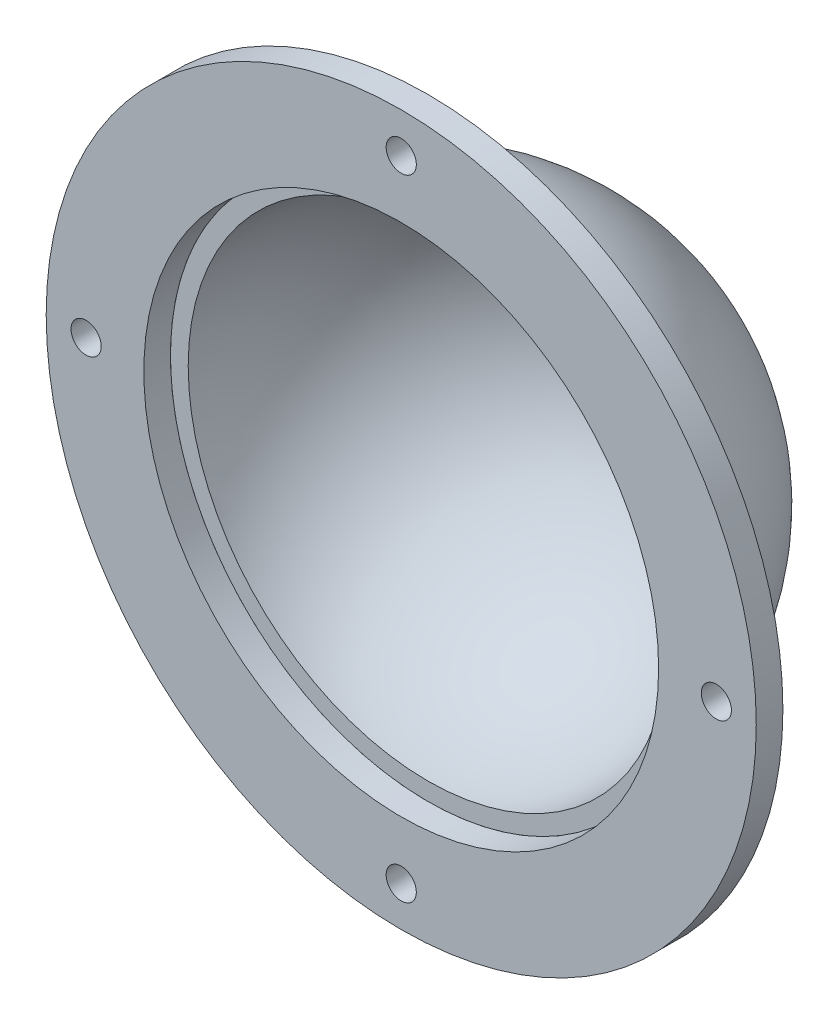
ISO-10303-21;
HEADER;
FILE_DESCRIPTION(('STEP AP214'),'2;1');
FILE_NAME('part.step','',(''),(''),'','','');
FILE_SCHEMA(('AUTOMOTIVE_DESIGN { 1 0 10303 214 1 1 1 1 }'));
ENDSEC;
DATA;
#1=APPLICATION_CONTEXT('core data for automotive mechanical design processes');
#2=APPLICATION_PROTOCOL_DEFINITION('international standard','automotive_design',2000,#1);
#3=PRODUCT_CONTEXT('',#1,'mechanical');
#4=PRODUCT('Part','Part','',(#3));
#5=PRODUCT_RELATED_PRODUCT_CATEGORY('part','',(#4));
#6=PRODUCT_DEFINITION_FORMATION('','',#4);
#7=PRODUCT_DEFINITION_CONTEXT('part definition',#1,'design');
#8=PRODUCT_DEFINITION('design','',#6,#7);
#9=PRODUCT_DEFINITION_SHAPE('','',#8);
#10=(LENGTH_UNIT() NAMED_UNIT(*) SI_UNIT(.MILLI.,.METRE.));
#11=(NAMED_UNIT(*) PLANE_ANGLE_UNIT() SI_UNIT($,.RADIAN.));
#12=(NAMED_UNIT(*) SI_UNIT($,.STERADIAN.) SOLID_ANGLE_UNIT());
#13=UNCERTAINTY_MEASURE_WITH_UNIT(LENGTH_MEASURE(1.E-05),#10,'distance_accuracy_value','');
#14=(GEOMETRIC_REPRESENTATION_CONTEXT(3) GLOBAL_UNCERTAINTY_ASSIGNED_CONTEXT((#13)) GLOBAL_UNIT_ASSIGNED_CONTEXT((#10,
#11,#12)) REPRESENTATION_CONTEXT('',''));
#15=CARTESIAN_POINT('',(0.,0.,0.));
#16=DIRECTION('',(0.,0.,1.));
#17=DIRECTION('',(1.,0.,0.));
#18=AXIS2_PLACEMENT_3D('',#15,#16,#17);
#19=CARTESIAN_POINT('',(0.,0.,0.));
#20=DIRECTION('',(0.,0.,-1.));
#21=DIRECTION('',(1.,0.,0.));
#22=AXIS2_PLACEMENT_3D('',#19,#20,#21);
#23=SPHERICAL_SURFACE('',#22,27.);
#24=CARTESIAN_POINT('',(0.,0.,0.));
#25=DIRECTION('',(0.,0.,-1.));
#26=DIRECTION('',(-1.,0.,0.));
#27=AXIS2_PLACEMENT_3D('',#24,#25,#26);
#28=CIRCLE('',#27,27.);
#29=CARTESIAN_POINT('',(-27.,0.,0.));
#30=VERTEX_POINT('',#29);
#31=EDGE_CURVE('E11',#30,#30,#28,.T.);
#32=ORIENTED_EDGE('',*,*,#31,.F.);
#33=EDGE_LOOP('',(#32));
#34=FACE_BOUND('',#33,.T.);
#35=ADVANCED_FACE('F47',(#34),#23,.F.);
#36=CARTESIAN_POINT('',(0.,0.,0.));
#37=DIRECTION('',(0.,0.,1.));
#38=DIRECTION('',(1.,0.,0.));
#39=AXIS2_PLACEMENT_3D('',#36,#37,#38);
#40=PLANE('',#39);
#41=ORIENTED_EDGE('',*,*,#31,.T.);
#42=EDGE_LOOP('',(#41));
#43=FACE_BOUND('',#42,.T.);
#44=CARTESIAN_POINT('',(0.,0.,0.));
#45=DIRECTION('',(0.,0.,-1.));
#46=DIRECTION('',(-1.,0.,0.));
#47=AXIS2_PLACEMENT_3D('',#44,#45,#46);
#48=CIRCLE('',#47,29.);
#49=CARTESIAN_POINT('',(-29.,0.,0.));
#50=VERTEX_POINT('',#49);
#51=EDGE_CURVE('E54',#50,#50,#48,.T.);
#52=ORIENTED_EDGE('',*,*,#51,.F.);
#53=EDGE_LOOP('',(#52));
#54=FACE_BOUND('',#53,.T.);
#55=ADVANCED_FACE('F64',(#43,#54),#40,.T.);
#56=CARTESIAN_POINT('',(0.,0.,0.));
#57=DIRECTION('',(0.,0.,-1.));
#58=DIRECTION('',(1.,0.,0.));
#59=AXIS2_PLACEMENT_3D('',#56,#57,#58);
#60=SPHERICAL_SURFACE('',#59,29.);
#61=ORIENTED_EDGE('',*,*,#51,.T.);
#62=EDGE_LOOP('',(#61));
#63=FACE_BOUND('',#62,.T.);
#64=ADVANCED_FACE('F62',(#63),#60,.T.);
#65=CLOSED_SHELL('',(#35,#55,#64));
#66=MANIFOLD_SOLID_BREP('B2',#65);
#67=CARTESIAN_POINT('',(0.,0.,3.));
#68=DIRECTION('',(0.,0.,1.));
#69=DIRECTION('',(1.,0.,0.));
#70=AXIS2_PLACEMENT_3D('',#67,#68,#69);
#71=PLANE('',#70);
#72=CARTESIAN_POINT('',(1.29236898960272E-13,-35.4999999999999,3.));
#73=DIRECTION('',(0.,0.,1.));
#74=DIRECTION('',(1.,0.,0.));
#75=AXIS2_PLACEMENT_3D('',#72,#73,#74);
#76=CIRCLE('',#75,1.7);
#77=CARTESIAN_POINT('',(1.70000000000013,-35.4999999999999,3.));
#78=VERTEX_POINT('',#77);
#79=EDGE_CURVE('E119',#78,#78,#76,.T.);
#80=ORIENTED_EDGE('',*,*,#79,.F.);
#81=EDGE_LOOP('',(#80));
#82=FACE_BOUND('',#81,.T.);
#83=CARTESIAN_POINT('',(0.,0.,3.));
#84=DIRECTION('',(0.,0.,1.));
#85=DIRECTION('',(1.,0.,0.));
#86=AXIS2_PLACEMENT_3D('',#83,#84,#85);
#87=CIRCLE('',#86,29.);
#88=CARTESIAN_POINT('',(29.,0.,3.));
#89=VERTEX_POINT('',#88);
#90=EDGE_CURVE('E106',#89,#89,#87,.T.);
#91=ORIENTED_EDGE('',*,*,#90,.F.);
#92=EDGE_LOOP('',(#91));
#93=FACE_BOUND('',#92,.T.);
#94=CARTESIAN_POINT('',(0.,0.,3.));
#95=DIRECTION('',(0.,0.,1.));
#96=DIRECTION('',(1.,0.,0.));
#97=AXIS2_PLACEMENT_3D('',#94,#95,#96);
#98=CIRCLE('',#97,40.);
#99=CARTESIAN_POINT('',(40.,0.,3.));
#100=VERTEX_POINT('',#99);
#101=EDGE_CURVE('E48',#100,#100,#98,.T.);
#102=ORIENTED_EDGE('',*,*,#101,.T.);
#103=EDGE_LOOP('',(#102));
#104=FACE_BOUND('',#103,.T.);
#105=CARTESIAN_POINT('',(0.,35.5,3.));
#106=DIRECTION('',(0.,0.,1.));
#107=DIRECTION('',(1.,0.,0.));
#108=AXIS2_PLACEMENT_3D('',#105,#106,#107);
#109=CIRCLE('',#108,1.7);
#110=CARTESIAN_POINT('',(1.7,35.5,3.));
#111=VERTEX_POINT('',#110);
#112=EDGE_CURVE('E101',#111,#111,#109,.T.);
#113=ORIENTED_EDGE('',*,*,#112,.F.);
#114=EDGE_LOOP('',(#113));
#115=FACE_BOUND('',#114,.T.);
#116=CARTESIAN_POINT('',(35.5,1.37259995036665E-13,3.));
#117=DIRECTION('',(0.,0.,1.));
#118=DIRECTION('',(1.,0.,0.));
#119=AXIS2_PLACEMENT_3D('',#116,#117,#118);
#120=CIRCLE('',#119,1.7);
#121=CARTESIAN_POINT('',(37.2,1.37259995036665E-13,3.));
#122=VERTEX_POINT('',#121);
#123=EDGE_CURVE('E115',#122,#122,#120,.T.);
#124=ORIENTED_EDGE('',*,*,#123,.F.);
#125=EDGE_LOOP('',(#124));
#126=FACE_BOUND('',#125,.T.);
#127=CARTESIAN_POINT('',(-35.4999999999999,0.,3.));
#128=DIRECTION('',(0.,0.,1.));
#129=DIRECTION('',(1.,0.,0.));
#130=AXIS2_PLACEMENT_3D('',#127,#128,#129);
#131=CIRCLE('',#130,1.7);
#132=CARTESIAN_POINT('',(-33.7999999999999,0.,3.));
#133=VERTEX_POINT('',#132);
#134=EDGE_CURVE('E124',#133,#133,#131,.T.);
#135=ORIENTED_EDGE('',*,*,#134,.F.);
#136=EDGE_LOOP('',(#135));
#137=FACE_BOUND('',#136,.T.);
#138=ADVANCED_FACE('F89',(#82,#93,#104,#115,#126,#137),#71,.T.);
#139=CARTESIAN_POINT('',(0.,0.,0.));
#140=DIRECTION('',(0.,0.,1.));
#141=DIRECTION('',(1.,0.,0.));
#142=AXIS2_PLACEMENT_3D('',#139,#140,#141);
#143=PLANE('',#142);
#144=CARTESIAN_POINT('',(0.,0.,0.));
#145=DIRECTION('',(0.,0.,1.));
#146=DIRECTION('',(1.,0.,0.));
#147=AXIS2_PLACEMENT_3D('',#144,#145,#146);
#148=CIRCLE('',#147,40.);
#149=CARTESIAN_POINT('',(40.,0.,0.));
#150=VERTEX_POINT('',#149);
#151=EDGE_CURVE('E94',#150,#150,#148,.T.);
#152=ORIENTED_EDGE('',*,*,#151,.F.);
#153=EDGE_LOOP('',(#152));
#154=FACE_BOUND('',#153,.T.);
#155=CARTESIAN_POINT('',(0.,35.5,0.));
#156=DIRECTION('',(0.,0.,1.));
#157=DIRECTION('',(1.,0.,0.));
#158=AXIS2_PLACEMENT_3D('',#155,#156,#157);
#159=CIRCLE('',#158,1.7);
#160=CARTESIAN_POINT('',(1.7,35.5,0.));
#161=VERTEX_POINT('',#160);
#162=EDGE_CURVE('E103',#161,#161,#159,.T.);
#163=ORIENTED_EDGE('',*,*,#162,.T.);
#164=EDGE_LOOP('',(#163));
#165=FACE_BOUND('',#164,.T.);
#166=CARTESIAN_POINT('',(0.,0.,0.));
#167=DIRECTION('',(0.,0.,1.));
#168=DIRECTION('',(1.,0.,0.));
#169=AXIS2_PLACEMENT_3D('',#166,#167,#168);
#170=CIRCLE('',#169,29.);
#171=CARTESIAN_POINT('',(29.,0.,0.));
#172=VERTEX_POINT('',#171);
#173=EDGE_CURVE('E108',#172,#172,#170,.T.);
#174=ORIENTED_EDGE('',*,*,#173,.T.);
#175=EDGE_LOOP('',(#174));
#176=FACE_BOUND('',#175,.T.);
#177=CARTESIAN_POINT('',(35.5,1.37259995036665E-13,0.));
#178=DIRECTION('',(0.,0.,1.));
#179=DIRECTION('',(1.,0.,0.));
#180=AXIS2_PLACEMENT_3D('',#177,#178,#179);
#181=CIRCLE('',#180,1.7);
#182=CARTESIAN_POINT('',(37.2,1.37259995036665E-13,0.));
#183=VERTEX_POINT('',#182);
#184=EDGE_CURVE('E113',#183,#183,#181,.T.);
#185=ORIENTED_EDGE('',*,*,#184,.T.);
#186=EDGE_LOOP('',(#185));
#187=FACE_BOUND('',#186,.T.);
#188=CARTESIAN_POINT('',(1.29236898960272E-13,-35.4999999999999,0.));
#189=DIRECTION('',(0.,0.,1.));
#190=DIRECTION('',(1.,0.,0.));
#191=AXIS2_PLACEMENT_3D('',#188,#189,#190);
#192=CIRCLE('',#191,1.7);
#193=CARTESIAN_POINT('',(1.70000000000013,-35.4999999999999,0.));
#194=VERTEX_POINT('',#193);
#195=EDGE_CURVE('E123',#194,#194,#192,.T.);
#196=ORIENTED_EDGE('',*,*,#195,.T.);
#197=EDGE_LOOP('',(#196));
#198=FACE_BOUND('',#197,.T.);
#199=CARTESIAN_POINT('',(-35.4999999999999,0.,0.));
#200=DIRECTION('',(0.,0.,1.));
#201=DIRECTION('',(1.,0.,0.));
#202=AXIS2_PLACEMENT_3D('',#199,#200,#201);
#203=CIRCLE('',#202,1.7);
#204=CARTESIAN_POINT('',(-33.7999999999999,0.,0.));
#205=VERTEX_POINT('',#204);
#206=EDGE_CURVE('E130',#205,#205,#203,.T.);
#207=ORIENTED_EDGE('',*,*,#206,.T.);
#208=EDGE_LOOP('',(#207));
#209=FACE_BOUND('',#208,.T.);
#210=ADVANCED_FACE('F137',(#154,#165,#176,#187,#198,#209),#143,.F.);
#211=CARTESIAN_POINT('',(0.,0.,3.));
#212=DIRECTION('',(0.,0.,-1.));
#213=DIRECTION('',(-1.,0.,0.));
#214=AXIS2_PLACEMENT_3D('',#211,#212,#213);
#215=CYLINDRICAL_SURFACE('',#214,40.);
#216=ORIENTED_EDGE('',*,*,#101,.F.);
#217=EDGE_LOOP('',(#216));
#218=FACE_BOUND('',#217,.T.);
#219=ORIENTED_EDGE('',*,*,#151,.T.);
#220=EDGE_LOOP('',(#219));
#221=FACE_BOUND('',#220,.T.);
#222=ADVANCED_FACE('F95',(#218,#221),#215,.T.);
#223=CARTESIAN_POINT('',(0.,35.5,3.));
#224=DIRECTION('',(0.,0.,-1.));
#225=DIRECTION('',(-1.,0.,0.));
#226=AXIS2_PLACEMENT_3D('',#223,#224,#225);
#227=CYLINDRICAL_SURFACE('',#226,1.7);
#228=ORIENTED_EDGE('',*,*,#112,.T.);
#229=EDGE_LOOP('',(#228));
#230=FACE_BOUND('',#229,.T.);
#231=ORIENTED_EDGE('',*,*,#162,.F.);
#232=EDGE_LOOP('',(#231));
#233=FACE_BOUND('',#232,.T.);
#234=ADVANCED_FACE('F150',(#230,#233),#227,.F.);
#235=CARTESIAN_POINT('',(0.,0.,3.));
#236=DIRECTION('',(0.,0.,-1.));
#237=DIRECTION('',(-1.,0.,0.));
#238=AXIS2_PLACEMENT_3D('',#235,#236,#237);
#239=CYLINDRICAL_SURFACE('',#238,29.);
#240=ORIENTED_EDGE('',*,*,#90,.T.);
#241=EDGE_LOOP('',(#240));
#242=FACE_BOUND('',#241,.T.);
#243=ORIENTED_EDGE('',*,*,#173,.F.);
#244=EDGE_LOOP('',(#243));
#245=FACE_BOUND('',#244,.T.);
#246=ADVANCED_FACE('F147',(#242,#245),#239,.F.);
#247=CARTESIAN_POINT('',(35.5,1.37259995036665E-13,3.));
#248=DIRECTION('',(0.,0.,-1.));
#249=DIRECTION('',(-1.,0.,0.));
#250=AXIS2_PLACEMENT_3D('',#247,#248,#249);
#251=CYLINDRICAL_SURFACE('',#250,1.7);
#252=ORIENTED_EDGE('',*,*,#123,.T.);
#253=EDGE_LOOP('',(#252));
#254=FACE_BOUND('',#253,.T.);
#255=ORIENTED_EDGE('',*,*,#184,.F.);
#256=EDGE_LOOP('',(#255));
#257=FACE_BOUND('',#256,.T.);
#258=ADVANCED_FACE('F152',(#254,#257),#251,.F.);
#259=CARTESIAN_POINT('',(1.29236898960272E-13,-35.4999999999999,3.));
#260=DIRECTION('',(0.,0.,-1.));
#261=DIRECTION('',(-1.,0.,0.));
#262=AXIS2_PLACEMENT_3D('',#259,#260,#261);
#263=CYLINDRICAL_SURFACE('',#262,1.7);
#264=ORIENTED_EDGE('',*,*,#79,.T.);
#265=EDGE_LOOP('',(#264));
#266=FACE_BOUND('',#265,.T.);
#267=ORIENTED_EDGE('',*,*,#195,.F.);
#268=EDGE_LOOP('',(#267));
#269=FACE_BOUND('',#268,.T.);
#270=ADVANCED_FACE('F158',(#266,#269),#263,.F.);
#271=CARTESIAN_POINT('',(-35.4999999999999,0.,3.));
#272=DIRECTION('',(0.,0.,-1.));
#273=DIRECTION('',(-1.,0.,0.));
#274=AXIS2_PLACEMENT_3D('',#271,#272,#273);
#275=CYLINDRICAL_SURFACE('',#274,1.7);
#276=ORIENTED_EDGE('',*,*,#134,.T.);
#277=EDGE_LOOP('',(#276));
#278=FACE_BOUND('',#277,.T.);
#279=ORIENTED_EDGE('',*,*,#206,.F.);
#280=EDGE_LOOP('',(#279));
#281=FACE_BOUND('',#280,.T.);
#282=ADVANCED_FACE('F134',(#278,#281),#275,.F.);
#283=CLOSED_SHELL('',(#138,#210,#222,#234,#246,#258,#270,#282));
#284=MANIFOLD_SOLID_BREP('B6',#283);
#285=ADVANCED_BREP_SHAPE_REPRESENTATION('',(#18,#66,#284),#14);
#286=SHAPE_DEFINITION_REPRESENTATION(#9,#285);
ENDSEC;
END-ISO-10303-21;
